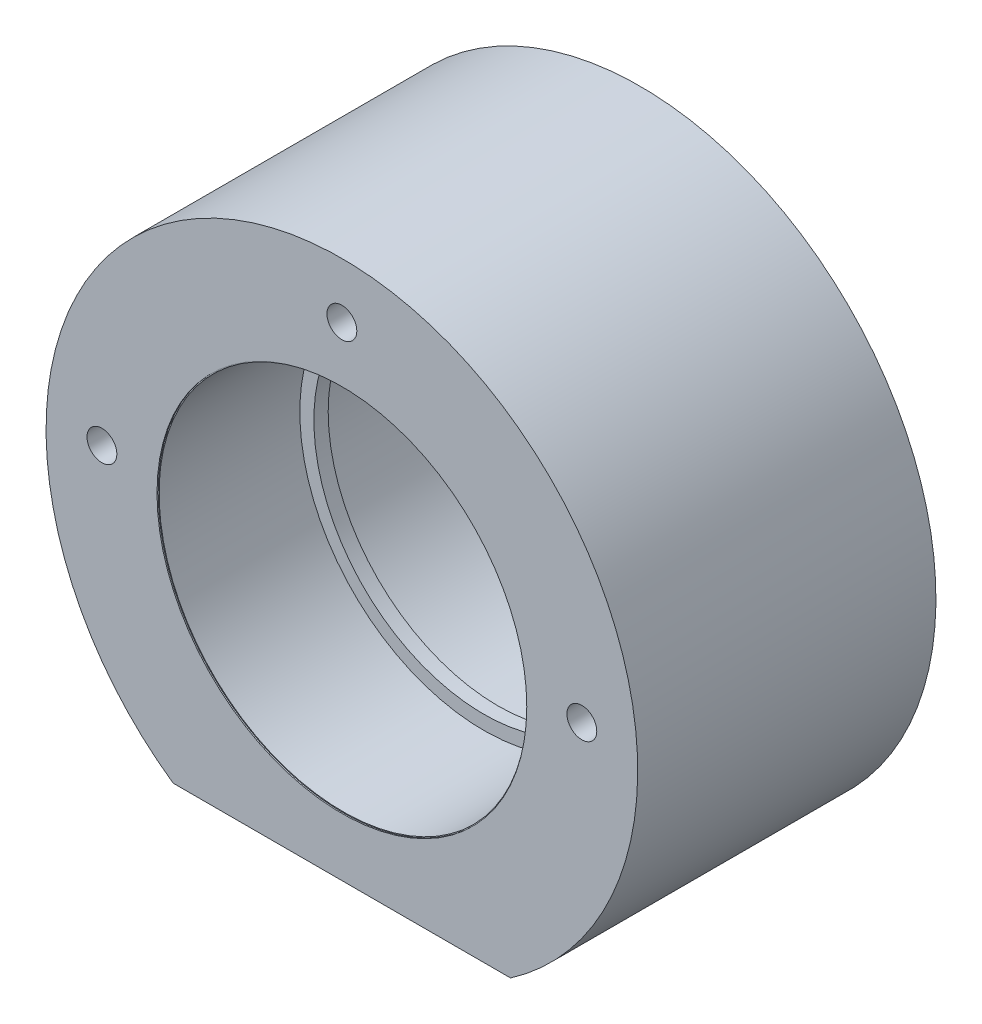
ISO-10303-21;
HEADER;
FILE_DESCRIPTION(('STEP AP214'),'2;1');
FILE_NAME('part.step','',(''),(''),'','','');
FILE_SCHEMA(('AUTOMOTIVE_DESIGN { 1 0 10303 214 1 1 1 1 }'));
ENDSEC;
DATA;
#1=APPLICATION_CONTEXT('core data for automotive mechanical design processes');
#2=APPLICATION_PROTOCOL_DEFINITION('international standard','automotive_design',2000,#1);
#3=PRODUCT_CONTEXT('',#1,'mechanical');
#4=PRODUCT('Part','Part','',(#3));
#5=PRODUCT_RELATED_PRODUCT_CATEGORY('part','',(#4));
#6=PRODUCT_DEFINITION_FORMATION('','',#4);
#7=PRODUCT_DEFINITION_CONTEXT('part definition',#1,'design');
#8=PRODUCT_DEFINITION('design','',#6,#7);
#9=PRODUCT_DEFINITION_SHAPE('','',#8);
#10=(LENGTH_UNIT() NAMED_UNIT(*) SI_UNIT(.MILLI.,.METRE.));
#11=(NAMED_UNIT(*) PLANE_ANGLE_UNIT() SI_UNIT($,.RADIAN.));
#12=(NAMED_UNIT(*) SI_UNIT($,.STERADIAN.) SOLID_ANGLE_UNIT());
#13=UNCERTAINTY_MEASURE_WITH_UNIT(LENGTH_MEASURE(1.E-05),#10,'distance_accuracy_value','');
#14=(GEOMETRIC_REPRESENTATION_CONTEXT(3) GLOBAL_UNCERTAINTY_ASSIGNED_CONTEXT((#13)) GLOBAL_UNIT_ASSIGNED_CONTEXT((#10,
#11,#12)) REPRESENTATION_CONTEXT('',''));
#15=CARTESIAN_POINT('',(0.,0.,0.));
#16=DIRECTION('',(0.,0.,1.));
#17=DIRECTION('',(1.,0.,0.));
#18=AXIS2_PLACEMENT_3D('',#15,#16,#17);
#19=CARTESIAN_POINT('',(0.,21.6034958595708,-82.4708842201519));
#20=DIRECTION('',(0.,0.,1.));
#21=DIRECTION('',(1.,0.,0.));
#22=AXIS2_PLACEMENT_3D('',#19,#20,#21);
#23=CYLINDRICAL_SURFACE('',#22,28.4985714215);
#24=CARTESIAN_POINT('',(0.,21.6034958595708,26.200714275));
#25=DIRECTION('',(0.,0.,1.));
#26=DIRECTION('',(1.,0.,0.));
#27=AXIS2_PLACEMENT_3D('',#24,#25,#26);
#28=CIRCLE('',#27,28.4985714215);
#29=CARTESIAN_POINT('',(28.4985714215,21.6034958595708,26.200714275));
#30=VERTEX_POINT('',#29);
#31=EDGE_CURVE('E100',#30,#30,#28,.F.);
#32=ORIENTED_EDGE('',*,*,#31,.F.);
#33=EDGE_LOOP('',(#32));
#34=FACE_BOUND('',#33,.T.);
#35=CARTESIAN_POINT('',(0.,21.6034958595708,23.799285725));
#36=DIRECTION('',(0.,0.,-1.));
#37=DIRECTION('',(-1.,0.,0.));
#38=AXIS2_PLACEMENT_3D('',#35,#36,#37);
#39=CIRCLE('',#38,28.4985714215);
#40=CARTESIAN_POINT('',(-28.4985714215,21.6034958595708,23.799285725));
#41=VERTEX_POINT('',#40);
#42=EDGE_CURVE('E51',#41,#41,#39,.F.);
#43=ORIENTED_EDGE('',*,*,#42,.F.);
#44=EDGE_LOOP('',(#43));
#45=FACE_BOUND('',#44,.T.);
#46=ADVANCED_FACE('F47',(#34,#45),#23,.F.);
#47=CARTESIAN_POINT('',(0.,21.6034958595708,69.285714275));
#48=DIRECTION('',(0.,0.,-1.));
#49=DIRECTION('',(-1.,0.,0.));
#50=AXIS2_PLACEMENT_3D('',#47,#48,#49);
#51=CYLINDRICAL_SURFACE('',#50,49.599999988);
#52=CARTESIAN_POINT('',(0.,21.6034958595708,50.000714275));
#53=DIRECTION('',(0.,0.,1.));
#54=DIRECTION('',(1.,0.,0.));
#55=AXIS2_PLACEMENT_3D('',#52,#53,#54);
#56=CIRCLE('',#55,49.599999988);
#57=CARTESIAN_POINT('',(28.2874458276026,-19.1393612734292,50.000714275));
#58=VERTEX_POINT('',#57);
#59=CARTESIAN_POINT('',(-28.2874458276026,-19.1393612734292,50.000714275));
#60=VERTEX_POINT('',#59);
#61=EDGE_CURVE('E63',#58,#60,#56,.T.);
#62=ORIENTED_EDGE('',*,*,#61,.F.);
#63=DIRECTION('',(0.,0.,-1.));
#64=VECTOR('',#63,1.);
#65=CARTESIAN_POINT('',(28.2874458276026,-19.1393612734292,69.285714275));
#66=LINE('',#65,#64);
#67=CARTESIAN_POINT('',(28.2874458276026,-19.1393612734292,-0.00071427499999388));
#68=VERTEX_POINT('',#67);
#69=EDGE_CURVE('E56',#58,#68,#66,.T.);
#70=ORIENTED_EDGE('',*,*,#69,.T.);
#71=CARTESIAN_POINT('',(0.,21.6034958595708,-0.000714275000000819));
#72=DIRECTION('',(0.,0.,1.));
#73=DIRECTION('',(1.,0.,0.));
#74=AXIS2_PLACEMENT_3D('',#71,#72,#73);
#75=CIRCLE('',#74,49.599999988);
#76=CARTESIAN_POINT('',(-28.2874458276026,-19.1393612734292,-0.000714275000000819));
#77=VERTEX_POINT('',#76);
#78=EDGE_CURVE('E99',#68,#77,#75,.T.);
#79=ORIENTED_EDGE('',*,*,#78,.T.);
#80=DIRECTION('',(0.,0.,-1.));
#81=VECTOR('',#80,1.);
#82=CARTESIAN_POINT('',(-28.2874458276026,-19.1393612734292,69.285714275));
#83=LINE('',#82,#81);
#84=EDGE_CURVE('E12',#60,#77,#83,.T.);
#85=ORIENTED_EDGE('',*,*,#84,.F.);
#86=EDGE_LOOP('',(#62,#70,#79,#85));
#87=FACE_BOUND('',#86,.T.);
#88=ADVANCED_FACE('F49',(#87),#51,.T.);
#89=CARTESIAN_POINT('',(-28.2874458276026,-19.1393612734292,69.285714275));
#90=DIRECTION('',(0.,1.,0.));
#91=DIRECTION('',(0.,0.,1.));
#92=AXIS2_PLACEMENT_3D('',#89,#90,#91);
#93=PLANE('',#92);
#94=DIRECTION('',(-1.,0.,0.));
#95=VECTOR('',#94,1.);
#96=CARTESIAN_POINT('',(0.,-19.1393612734292,50.000714275));
#97=LINE('',#96,#95);
#98=EDGE_CURVE('E74',#58,#60,#97,.T.);
#99=ORIENTED_EDGE('',*,*,#98,.T.);
#100=ORIENTED_EDGE('',*,*,#84,.T.);
#101=DIRECTION('',(1.,0.,0.));
#102=VECTOR('',#101,1.);
#103=CARTESIAN_POINT('',(0.,-19.1393612734292,-0.000714275000000819));
#104=LINE('',#103,#102);
#105=EDGE_CURVE('E86',#77,#68,#104,.T.);
#106=ORIENTED_EDGE('',*,*,#105,.T.);
#107=ORIENTED_EDGE('',*,*,#69,.F.);
#108=EDGE_LOOP('',(#99,#100,#106,#107));
#109=FACE_BOUND('',#108,.T.);
#110=ADVANCED_FACE('F84',(#109),#93,.F.);
#111=CARTESIAN_POINT('',(0.,21.6034958595708,49.799999994));
#112=DIRECTION('',(0.,0.,1.));
#113=DIRECTION('',(1.,0.,0.));
#114=AXIS2_PLACEMENT_3D('',#111,#112,#113);
#115=CYLINDRICAL_SURFACE('',#114,30.9999999925);
#116=CARTESIAN_POINT('',(0.,21.6034958595708,49.799999994));
#117=DIRECTION('',(0.,0.,1.));
#118=DIRECTION('',(1.,0.,0.));
#119=AXIS2_PLACEMENT_3D('',#116,#117,#118);
#120=CIRCLE('',#119,30.9999999925);
#121=CARTESIAN_POINT('',(30.9999999925,21.6034958595708,49.799999994));
#122=VERTEX_POINT('',#121);
#123=EDGE_CURVE('E87',#122,#122,#120,.T.);
#124=ORIENTED_EDGE('',*,*,#123,.F.);
#125=EDGE_LOOP('',(#124));
#126=FACE_BOUND('',#125,.T.);
#127=CARTESIAN_POINT('',(0.,21.6034958595708,50.000714275));
#128=DIRECTION('',(0.,0.,1.));
#129=DIRECTION('',(1.,0.,0.));
#130=AXIS2_PLACEMENT_3D('',#127,#128,#129);
#131=CIRCLE('',#130,30.9999999925);
#132=CARTESIAN_POINT('',(30.9999999925,21.6034958595708,50.000714275));
#133=VERTEX_POINT('',#132);
#134=EDGE_CURVE('E79',#133,#133,#131,.F.);
#135=ORIENTED_EDGE('',*,*,#134,.F.);
#136=EDGE_LOOP('',(#135));
#137=FACE_BOUND('',#136,.T.);
#138=ADVANCED_FACE('F258',(#126,#137),#115,.F.);
#139=CARTESIAN_POINT('',(0.,21.6034958595708,49.799999994));
#140=DIRECTION('',(0.,0.,1.));
#141=DIRECTION('',(1.,0.,0.));
#142=AXIS2_PLACEMENT_3D('',#139,#140,#141);
#143=PLANE('',#142);
#144=CARTESIAN_POINT('',(0.,21.6034958595708,49.799999994));
#145=DIRECTION('',(0.,0.,1.));
#146=DIRECTION('',(1.,0.,0.));
#147=AXIS2_PLACEMENT_3D('',#144,#145,#146);
#148=CIRCLE('',#147,30.85);
#149=CARTESIAN_POINT('',(30.85,21.6034958595708,49.799999994));
#150=VERTEX_POINT('',#149);
#151=EDGE_CURVE('E81',#150,#150,#148,.T.);
#152=ORIENTED_EDGE('',*,*,#151,.F.);
#153=EDGE_LOOP('',(#152));
#154=FACE_BOUND('',#153,.T.);
#155=ORIENTED_EDGE('',*,*,#123,.T.);
#156=EDGE_LOOP('',(#155));
#157=FACE_BOUND('',#156,.T.);
#158=ADVANCED_FACE('F142',(#154,#157),#143,.T.);
#159=CARTESIAN_POINT('',(0.,21.6034958595708,0.200000005999997));
#160=DIRECTION('',(0.,0.,-1.));
#161=DIRECTION('',(-1.,0.,0.));
#162=AXIS2_PLACEMENT_3D('',#159,#160,#161);
#163=CYLINDRICAL_SURFACE('',#162,30.9999999925);
#164=CARTESIAN_POINT('',(0.,21.6034958595708,-0.000714275000000819));
#165=DIRECTION('',(0.,0.,1.));
#166=DIRECTION('',(1.,0.,0.));
#167=AXIS2_PLACEMENT_3D('',#164,#165,#166);
#168=CIRCLE('',#167,30.9999999925);
#169=CARTESIAN_POINT('',(30.9999999925,21.6034958595708,-0.000714275000000819));
#170=VERTEX_POINT('',#169);
#171=EDGE_CURVE('E94',#170,#170,#168,.T.);
#172=ORIENTED_EDGE('',*,*,#171,.F.);
#173=EDGE_LOOP('',(#172));
#174=FACE_BOUND('',#173,.T.);
#175=CARTESIAN_POINT('',(0.,21.6034958595708,0.200000005999997));
#176=DIRECTION('',(0.,0.,1.));
#177=DIRECTION('',(1.,0.,0.));
#178=AXIS2_PLACEMENT_3D('',#175,#176,#177);
#179=CIRCLE('',#178,30.9999999925);
#180=CARTESIAN_POINT('',(30.9999999925,21.6034958595708,0.200000005999997));
#181=VERTEX_POINT('',#180);
#182=EDGE_CURVE('E90',#181,#181,#179,.T.);
#183=ORIENTED_EDGE('',*,*,#182,.T.);
#184=EDGE_LOOP('',(#183));
#185=FACE_BOUND('',#184,.T.);
#186=ADVANCED_FACE('F129',(#174,#185),#163,.F.);
#187=CARTESIAN_POINT('',(0.,21.6034958595708,0.200000005999997));
#188=DIRECTION('',(0.,0.,-1.));
#189=DIRECTION('',(1.,0.,0.));
#190=AXIS2_PLACEMENT_3D('',#187,#188,#189);
#191=PLANE('',#190);
#192=CARTESIAN_POINT('',(0.,21.6034958595708,0.200000005999998));
#193=DIRECTION('',(0.,0.,-1.));
#194=DIRECTION('',(-1.,0.,0.));
#195=AXIS2_PLACEMENT_3D('',#192,#193,#194);
#196=CIRCLE('',#195,30.85);
#197=CARTESIAN_POINT('',(-30.85,21.6034958595708,0.200000005999998));
#198=VERTEX_POINT('',#197);
#199=EDGE_CURVE('E105',#198,#198,#196,.F.);
#200=ORIENTED_EDGE('',*,*,#199,.T.);
#201=EDGE_LOOP('',(#200));
#202=FACE_BOUND('',#201,.T.);
#203=ORIENTED_EDGE('',*,*,#182,.F.);
#204=EDGE_LOOP('',(#203));
#205=FACE_BOUND('',#204,.T.);
#206=ADVANCED_FACE('F131',(#202,#205),#191,.T.);
#207=CARTESIAN_POINT('',(0.,21.6034958595708,-0.000714275000000819));
#208=DIRECTION('',(0.,0.,1.));
#209=DIRECTION('',(1.,0.,0.));
#210=AXIS2_PLACEMENT_3D('',#207,#208,#209);
#211=PLANE('',#210);
#212=CARTESIAN_POINT('',(-40.2334024909348,23.9193810040543,-0.000714275000000819));
#213=DIRECTION('',(0.,0.,1.));
#214=DIRECTION('',(1.,0.,0.));
#215=AXIS2_PLACEMENT_3D('',#212,#213,#214);
#216=CIRCLE('',#215,2.5);
#217=CARTESIAN_POINT('',(-37.7334024909348,23.9193810040543,-0.000714275000001686));
#218=VERTEX_POINT('',#217);
#219=EDGE_CURVE('E112',#218,#218,#216,.F.);
#220=ORIENTED_EDGE('',*,*,#219,.F.);
#221=EDGE_LOOP('',(#220));
#222=FACE_BOUND('',#221,.T.);
#223=CARTESIAN_POINT('',(40.2334007714421,23.9194108762585,-0.000714275000000819));
#224=DIRECTION('',(0.,0.,1.));
#225=DIRECTION('',(1.,0.,0.));
#226=AXIS2_PLACEMENT_3D('',#223,#224,#225);
#227=CIRCLE('',#226,2.5);
#228=CARTESIAN_POINT('',(42.7334007714421,23.9194108762585,-0.000714275000001686));
#229=VERTEX_POINT('',#228);
#230=EDGE_CURVE('E193',#229,#229,#227,.F.);
#231=ORIENTED_EDGE('',*,*,#230,.F.);
#232=EDGE_LOOP('',(#231));
#233=FACE_BOUND('',#232,.T.);
#234=CARTESIAN_POINT('',(0.,61.9034958595708,-0.000714275000000819));
#235=DIRECTION('',(0.,0.,1.));
#236=DIRECTION('',(1.,0.,0.));
#237=AXIS2_PLACEMENT_3D('',#234,#235,#236);
#238=CIRCLE('',#237,2.5);
#239=CARTESIAN_POINT('',(2.5,61.9034958595708,-0.000714275000001686));
#240=VERTEX_POINT('',#239);
#241=EDGE_CURVE('E197',#240,#240,#238,.F.);
#242=ORIENTED_EDGE('',*,*,#241,.F.);
#243=EDGE_LOOP('',(#242));
#244=FACE_BOUND('',#243,.T.);
#245=ORIENTED_EDGE('',*,*,#171,.T.);
#246=EDGE_LOOP('',(#245));
#247=FACE_BOUND('',#246,.T.);
#248=ORIENTED_EDGE('',*,*,#78,.F.);
#249=ORIENTED_EDGE('',*,*,#105,.F.);
#250=EDGE_LOOP('',(#248,#249));
#251=FACE_BOUND('',#250,.T.);
#252=ADVANCED_FACE('F133',(#222,#233,#244,#247,#251),#211,.F.);
#253=CARTESIAN_POINT('',(0.,21.6034958595708,50.000714275));
#254=DIRECTION('',(0.,0.,1.));
#255=DIRECTION('',(1.,0.,0.));
#256=AXIS2_PLACEMENT_3D('',#253,#254,#255);
#257=PLANE('',#256);
#258=CARTESIAN_POINT('',(-40.2334024909348,23.9193810040543,50.000714275));
#259=DIRECTION('',(0.,0.,1.));
#260=DIRECTION('',(1.,0.,0.));
#261=AXIS2_PLACEMENT_3D('',#258,#259,#260);
#262=CIRCLE('',#261,2.5);
#263=CARTESIAN_POINT('',(-37.7334024909348,23.9193810040543,50.000714275));
#264=VERTEX_POINT('',#263);
#265=EDGE_CURVE('E117',#264,#264,#262,.T.);
#266=ORIENTED_EDGE('',*,*,#265,.F.);
#267=EDGE_LOOP('',(#266));
#268=FACE_BOUND('',#267,.T.);
#269=CARTESIAN_POINT('',(40.2334007714421,23.9194108762585,50.000714275));
#270=DIRECTION('',(0.,0.,1.));
#271=DIRECTION('',(1.,0.,0.));
#272=AXIS2_PLACEMENT_3D('',#269,#270,#271);
#273=CIRCLE('',#272,2.5);
#274=CARTESIAN_POINT('',(42.7334007714421,23.9194108762585,50.000714275));
#275=VERTEX_POINT('',#274);
#276=EDGE_CURVE('E190',#275,#275,#273,.T.);
#277=ORIENTED_EDGE('',*,*,#276,.F.);
#278=EDGE_LOOP('',(#277));
#279=FACE_BOUND('',#278,.T.);
#280=CARTESIAN_POINT('',(0.,61.9034958595708,50.000714275));
#281=DIRECTION('',(0.,0.,1.));
#282=DIRECTION('',(1.,0.,0.));
#283=AXIS2_PLACEMENT_3D('',#280,#281,#282);
#284=CIRCLE('',#283,2.5);
#285=CARTESIAN_POINT('',(2.5,61.9034958595708,50.000714275));
#286=VERTEX_POINT('',#285);
#287=EDGE_CURVE('E121',#286,#286,#284,.T.);
#288=ORIENTED_EDGE('',*,*,#287,.F.);
#289=EDGE_LOOP('',(#288));
#290=FACE_BOUND('',#289,.T.);
#291=ORIENTED_EDGE('',*,*,#61,.T.);
#292=ORIENTED_EDGE('',*,*,#98,.F.);
#293=EDGE_LOOP('',(#291,#292));
#294=FACE_BOUND('',#293,.T.);
#295=ORIENTED_EDGE('',*,*,#134,.T.);
#296=EDGE_LOOP('',(#295));
#297=FACE_BOUND('',#296,.T.);
#298=ADVANCED_FACE('F75',(#268,#279,#290,#294,#297),#257,.T.);
#299=CARTESIAN_POINT('',(0.,21.6034958595708,26.200714275));
#300=DIRECTION('',(0.,0.,1.));
#301=DIRECTION('',(1.,0.,0.));
#302=AXIS2_PLACEMENT_3D('',#299,#300,#301);
#303=PLANE('',#302);
#304=CARTESIAN_POINT('',(0.,21.6034958595708,26.200714275));
#305=DIRECTION('',(0.,0.,1.));
#306=DIRECTION('',(1.,0.,0.));
#307=AXIS2_PLACEMENT_3D('',#304,#305,#306);
#308=CIRCLE('',#307,30.85);
#309=CARTESIAN_POINT('',(30.85,21.6034958595708,26.200714275));
#310=VERTEX_POINT('',#309);
#311=EDGE_CURVE('E103',#310,#310,#308,.T.);
#312=ORIENTED_EDGE('',*,*,#311,.T.);
#313=EDGE_LOOP('',(#312));
#314=FACE_BOUND('',#313,.T.);
#315=ORIENTED_EDGE('',*,*,#31,.T.);
#316=EDGE_LOOP('',(#315));
#317=FACE_BOUND('',#316,.T.);
#318=ADVANCED_FACE('F156',(#314,#317),#303,.T.);
#319=CARTESIAN_POINT('',(0.,21.6034958595708,26.200714275));
#320=DIRECTION('',(0.,0.,1.));
#321=DIRECTION('',(1.,0.,0.));
#322=AXIS2_PLACEMENT_3D('',#319,#320,#321);
#323=CYLINDRICAL_SURFACE('',#322,30.85);
#324=ORIENTED_EDGE('',*,*,#151,.T.);
#325=EDGE_LOOP('',(#324));
#326=FACE_BOUND('',#325,.T.);
#327=ORIENTED_EDGE('',*,*,#311,.F.);
#328=EDGE_LOOP('',(#327));
#329=FACE_BOUND('',#328,.T.);
#330=ADVANCED_FACE('F158',(#326,#329),#323,.F.);
#331=CARTESIAN_POINT('',(0.,21.6034958595708,23.799285725));
#332=DIRECTION('',(0.,0.,-1.));
#333=DIRECTION('',(1.,0.,0.));
#334=AXIS2_PLACEMENT_3D('',#331,#332,#333);
#335=PLANE('',#334);
#336=CARTESIAN_POINT('',(0.,21.6034958595708,23.799285725));
#337=DIRECTION('',(0.,0.,1.));
#338=DIRECTION('',(1.,0.,0.));
#339=AXIS2_PLACEMENT_3D('',#336,#337,#338);
#340=CIRCLE('',#339,30.85);
#341=CARTESIAN_POINT('',(30.85,21.6034958595708,23.799285725));
#342=VERTEX_POINT('',#341);
#343=EDGE_CURVE('E107',#342,#342,#340,.T.);
#344=ORIENTED_EDGE('',*,*,#343,.F.);
#345=EDGE_LOOP('',(#344));
#346=FACE_BOUND('',#345,.T.);
#347=ORIENTED_EDGE('',*,*,#42,.T.);
#348=EDGE_LOOP('',(#347));
#349=FACE_BOUND('',#348,.T.);
#350=ADVANCED_FACE('F161',(#346,#349),#335,.T.);
#351=CARTESIAN_POINT('',(0.,21.6034958595708,23.799285725));
#352=DIRECTION('',(0.,0.,-1.));
#353=DIRECTION('',(-1.,0.,0.));
#354=AXIS2_PLACEMENT_3D('',#351,#352,#353);
#355=CYLINDRICAL_SURFACE('',#354,30.85);
#356=ORIENTED_EDGE('',*,*,#199,.F.);
#357=EDGE_LOOP('',(#356));
#358=FACE_BOUND('',#357,.T.);
#359=ORIENTED_EDGE('',*,*,#343,.T.);
#360=EDGE_LOOP('',(#359));
#361=FACE_BOUND('',#360,.T.);
#362=ADVANCED_FACE('F166',(#358,#361),#355,.F.);
#363=CARTESIAN_POINT('',(0.,61.9034958595708,-7.07178208686548));
#364=DIRECTION('',(0.,0.,1.));
#365=DIRECTION('',(1.,0.,0.));
#366=AXIS2_PLACEMENT_3D('',#363,#364,#365);
#367=CYLINDRICAL_SURFACE('',#366,2.5);
#368=CARTESIAN_POINT('',(2.5,61.9034958595708,50.000714275));
#369=CARTESIAN_POINT('',(2.5,61.9034958595708,49.4798660609375));
#370=CARTESIAN_POINT('',(2.5,61.9034958595708,48.959017846875));
#371=CARTESIAN_POINT('',(2.5,61.9034958595708,47.91732141875));
#372=CARTESIAN_POINT('',(2.5,61.9034958595708,47.3964732046875));
#373=CARTESIAN_POINT('',(2.5,61.9034958595708,46.3547767765625));
#374=CARTESIAN_POINT('',(2.5,61.9034958595708,45.8339285625));
#375=CARTESIAN_POINT('',(2.5,61.9034958595708,44.792232134375));
#376=CARTESIAN_POINT('',(2.5,61.9034958595708,44.2713839203125));
#377=CARTESIAN_POINT('',(2.5,61.9034958595708,43.2296874921875));
#378=CARTESIAN_POINT('',(2.5,61.9034958595708,42.708839278125));
#379=CARTESIAN_POINT('',(2.5,61.9034958595708,41.66714285));
#380=CARTESIAN_POINT('',(2.5,61.9034958595708,41.1462946359375));
#381=CARTESIAN_POINT('',(2.5,61.9034958595708,40.1045982078125));
#382=CARTESIAN_POINT('',(2.5,61.9034958595708,39.58374999375));
#383=CARTESIAN_POINT('',(2.5,61.9034958595708,38.542053565625));
#384=CARTESIAN_POINT('',(2.5,61.9034958595708,38.0212053515625));
#385=CARTESIAN_POINT('',(2.5,61.9034958595708,36.9795089234375));
#386=CARTESIAN_POINT('',(2.5,61.9034958595708,36.458660709375));
#387=CARTESIAN_POINT('',(2.5,61.9034958595708,35.41696428125));
#388=CARTESIAN_POINT('',(2.5,61.9034958595708,34.8961160671875));
#389=CARTESIAN_POINT('',(2.5,61.9034958595708,33.8544196390625));
#390=CARTESIAN_POINT('',(2.5,61.9034958595708,33.333571425));
#391=CARTESIAN_POINT('',(2.5,61.9034958595708,32.291874996875));
#392=CARTESIAN_POINT('',(2.5,61.9034958595708,31.7710267828125));
#393=CARTESIAN_POINT('',(2.5,61.9034958595708,30.7293303546875));
#394=CARTESIAN_POINT('',(2.5,61.9034958595708,30.208482140625));
#395=CARTESIAN_POINT('',(2.5,61.9034958595708,29.1667857125));
#396=CARTESIAN_POINT('',(2.5,61.9034958595708,28.6459374984375));
#397=CARTESIAN_POINT('',(2.5,61.9034958595708,27.6042410703125));
#398=CARTESIAN_POINT('',(2.5,61.9034958595708,27.08339285625));
#399=CARTESIAN_POINT('',(2.5,61.9034958595708,26.041696428125));
#400=CARTESIAN_POINT('',(2.5,61.9034958595708,25.5208482140625));
#401=CARTESIAN_POINT('',(2.5,61.9034958595708,24.4791517859375));
#402=CARTESIAN_POINT('',(2.5,61.9034958595708,23.958303571875));
#403=CARTESIAN_POINT('',(2.5,61.9034958595708,22.91660714375));
#404=CARTESIAN_POINT('',(2.5,61.9034958595708,22.3957589296875));
#405=CARTESIAN_POINT('',(2.5,61.9034958595708,21.3540625015625));
#406=CARTESIAN_POINT('',(2.5,61.9034958595708,20.8332142875));
#407=CARTESIAN_POINT('',(2.5,61.9034958595708,19.791517859375));
#408=CARTESIAN_POINT('',(2.5,61.9034958595708,19.2706696453125));
#409=CARTESIAN_POINT('',(2.5,61.9034958595708,18.2289732171875));
#410=CARTESIAN_POINT('',(2.5,61.9034958595708,17.708125003125));
#411=CARTESIAN_POINT('',(2.5,61.9034958595708,16.666428575));
#412=CARTESIAN_POINT('',(2.5,61.9034958595708,16.1455803609375));
#413=CARTESIAN_POINT('',(2.5,61.9034958595708,15.1038839328125));
#414=CARTESIAN_POINT('',(2.5,61.9034958595708,14.58303571875));
#415=CARTESIAN_POINT('',(2.5,61.9034958595708,13.541339290625));
#416=CARTESIAN_POINT('',(2.5,61.9034958595708,13.0204910765625));
#417=CARTESIAN_POINT('',(2.5,61.9034958595708,11.9787946484375));
#418=CARTESIAN_POINT('',(2.5,61.9034958595708,11.457946434375));
#419=CARTESIAN_POINT('',(2.5,61.9034958595708,10.41625000625));
#420=CARTESIAN_POINT('',(2.5,61.9034958595708,9.8954017921875));
#421=CARTESIAN_POINT('',(2.5,61.9034958595708,8.8537053640625));
#422=CARTESIAN_POINT('',(2.5,61.9034958595708,8.33285715));
#423=CARTESIAN_POINT('',(2.5,61.9034958595708,7.291160721875));
#424=CARTESIAN_POINT('',(2.5,61.9034958595708,6.7703125078125));
#425=CARTESIAN_POINT('',(2.5,61.9034958595708,5.7286160796875));
#426=CARTESIAN_POINT('',(2.5,61.9034958595708,5.207767865625));
#427=CARTESIAN_POINT('',(2.5,61.9034958595708,4.1660714375));
#428=CARTESIAN_POINT('',(2.5,61.9034958595708,3.6452232234375));
#429=CARTESIAN_POINT('',(2.5,61.9034958595708,2.6035267953125));
#430=CARTESIAN_POINT('',(2.5,61.9034958595708,2.08267858125));
#431=CARTESIAN_POINT('',(2.5,61.9034958595708,1.040982153125));
#432=CARTESIAN_POINT('',(2.5,61.9034958595708,0.5201339390625));
#433=CARTESIAN_POINT('',(2.5,61.9034958595708,-0.000714275000001686));
#434=B_SPLINE_CURVE_WITH_KNOTS('',3,(#368,#369,#370,#371,#372,#373,#374,#375,#376,#377,#378,
#379,#380,#381,#382,#383,#384,#385,#386,#387,#388,#389,#390,#391,#392,#393,#394,#395,#396,#397,
#398,#399,#400,#401,#402,#403,#404,#405,#406,#407,#408,#409,#410,#411,#412,#413,#414,#415,#416,
#417,#418,#419,#420,#421,#422,#423,#424,#425,#426,#427,#428,#429,#430,#431,#432,#433),
.UNSPECIFIED.,.F.,.F.,(4,2,2,2,2,2,2,2,2,2,2,2,2,2,2,2,2,2,2,2,2,2,2,2,2,2,2,2,2,2,2,2,4),(0.,
1.5625446421875,3.125089284375,4.6876339265625,6.25017856875,7.8127232109375,9.37526785312501,
10.9378124953125,12.5003571375,14.0629017796875,15.625446421875,17.1879910640625,18.75053570625,
20.3130803484375,21.875624990625,23.4381696328125,25.000714275,26.5632589171875,28.125803559375,
29.6883482015625,31.25089284375,32.8134374859375,34.375982128125,35.9385267703125,37.5010714125,
39.0636160546875,40.626160696875,42.1887053390625,43.75124998125,45.3137946234375,
46.876339265625,48.4388839078125,50.00142855),.UNSPECIFIED.);
#435=EDGE_CURVE('BSEAM169',#286,#240,#434,.T.);
#436=ORIENTED_EDGE('',*,*,#287,.T.);
#437=ORIENTED_EDGE('',*,*,#241,.T.);
#438=ORIENTED_EDGE('',*,*,#435,.T.);
#439=ORIENTED_EDGE('',*,*,#435,.F.);
#440=EDGE_LOOP('',(#436,#438,#437,#439));
#441=FACE_BOUND('',#440,.T.);
#442=ADVANCED_FACE('F169',(#441),#367,.F.);
#443=CARTESIAN_POINT('',(40.2334007714421,23.9194108762585,-7.07178208686548));
#444=DIRECTION('',(0.,0.,1.));
#445=DIRECTION('',(1.,0.,0.));
#446=AXIS2_PLACEMENT_3D('',#443,#444,#445);
#447=CYLINDRICAL_SURFACE('',#446,2.5);
#448=CARTESIAN_POINT('',(42.7334007714421,23.9194108762585,-0.000714275000001686));
#449=CARTESIAN_POINT('',(42.7334007714421,23.9194108762585,0.520133939062498));
#450=CARTESIAN_POINT('',(42.7334007714421,23.9194108762585,1.040982153125));
#451=CARTESIAN_POINT('',(42.7334007714421,23.9194108762585,2.08267858125));
#452=CARTESIAN_POINT('',(42.7334007714421,23.9194108762585,2.6035267953125));
#453=CARTESIAN_POINT('',(42.7334007714421,23.9194108762585,3.6452232234375));
#454=CARTESIAN_POINT('',(42.7334007714421,23.9194108762585,4.1660714375));
#455=CARTESIAN_POINT('',(42.7334007714421,23.9194108762585,5.207767865625));
#456=CARTESIAN_POINT('',(42.7334007714421,23.9194108762585,5.7286160796875));
#457=CARTESIAN_POINT('',(42.7334007714421,23.9194108762585,6.7703125078125));
#458=CARTESIAN_POINT('',(42.7334007714421,23.9194108762585,7.291160721875));
#459=CARTESIAN_POINT('',(42.7334007714421,23.9194108762585,8.33285715));
#460=CARTESIAN_POINT('',(42.7334007714421,23.9194108762585,8.8537053640625));
#461=CARTESIAN_POINT('',(42.7334007714421,23.9194108762585,9.8954017921875));
#462=CARTESIAN_POINT('',(42.7334007714421,23.9194108762585,10.41625000625));
#463=CARTESIAN_POINT('',(42.7334007714421,23.9194108762585,11.457946434375));
#464=CARTESIAN_POINT('',(42.7334007714421,23.9194108762585,11.9787946484375));
#465=CARTESIAN_POINT('',(42.7334007714421,23.9194108762585,13.0204910765625));
#466=CARTESIAN_POINT('',(42.7334007714421,23.9194108762585,13.541339290625));
#467=CARTESIAN_POINT('',(42.7334007714421,23.9194108762585,14.58303571875));
#468=CARTESIAN_POINT('',(42.7334007714421,23.9194108762585,15.1038839328125));
#469=CARTESIAN_POINT('',(42.7334007714421,23.9194108762585,16.1455803609375));
#470=CARTESIAN_POINT('',(42.7334007714421,23.9194108762585,16.666428575));
#471=CARTESIAN_POINT('',(42.7334007714421,23.9194108762585,17.708125003125));
#472=CARTESIAN_POINT('',(42.7334007714421,23.9194108762585,18.2289732171875));
#473=CARTESIAN_POINT('',(42.7334007714421,23.9194108762585,19.2706696453125));
#474=CARTESIAN_POINT('',(42.7334007714421,23.9194108762585,19.791517859375));
#475=CARTESIAN_POINT('',(42.7334007714421,23.9194108762585,20.8332142875));
#476=CARTESIAN_POINT('',(42.7334007714421,23.9194108762585,21.3540625015625));
#477=CARTESIAN_POINT('',(42.7334007714421,23.9194108762585,22.3957589296875));
#478=CARTESIAN_POINT('',(42.7334007714421,23.9194108762585,22.91660714375));
#479=CARTESIAN_POINT('',(42.7334007714421,23.9194108762585,23.958303571875));
#480=CARTESIAN_POINT('',(42.7334007714421,23.9194108762585,24.4791517859375));
#481=CARTESIAN_POINT('',(42.7334007714421,23.9194108762585,25.5208482140625));
#482=CARTESIAN_POINT('',(42.7334007714421,23.9194108762585,26.041696428125));
#483=CARTESIAN_POINT('',(42.7334007714421,23.9194108762585,27.08339285625));
#484=CARTESIAN_POINT('',(42.7334007714421,23.9194108762585,27.6042410703125));
#485=CARTESIAN_POINT('',(42.7334007714421,23.9194108762585,28.6459374984375));
#486=CARTESIAN_POINT('',(42.7334007714421,23.9194108762585,29.1667857125));
#487=CARTESIAN_POINT('',(42.7334007714421,23.9194108762585,30.208482140625));
#488=CARTESIAN_POINT('',(42.7334007714421,23.9194108762585,30.7293303546875));
#489=CARTESIAN_POINT('',(42.7334007714421,23.9194108762585,31.7710267828125));
#490=CARTESIAN_POINT('',(42.7334007714421,23.9194108762585,32.291874996875));
#491=CARTESIAN_POINT('',(42.7334007714421,23.9194108762585,33.333571425));
#492=CARTESIAN_POINT('',(42.7334007714421,23.9194108762585,33.8544196390625));
#493=CARTESIAN_POINT('',(42.7334007714421,23.9194108762585,34.8961160671875));
#494=CARTESIAN_POINT('',(42.7334007714421,23.9194108762585,35.41696428125));
#495=CARTESIAN_POINT('',(42.7334007714421,23.9194108762585,36.458660709375));
#496=CARTESIAN_POINT('',(42.7334007714421,23.9194108762585,36.9795089234375));
#497=CARTESIAN_POINT('',(42.7334007714421,23.9194108762585,38.0212053515625));
#498=CARTESIAN_POINT('',(42.7334007714421,23.9194108762585,38.542053565625));
#499=CARTESIAN_POINT('',(42.7334007714421,23.9194108762585,39.58374999375));
#500=CARTESIAN_POINT('',(42.7334007714421,23.9194108762585,40.1045982078125));
#501=CARTESIAN_POINT('',(42.7334007714421,23.9194108762585,41.1462946359375));
#502=CARTESIAN_POINT('',(42.7334007714421,23.9194108762585,41.66714285));
#503=CARTESIAN_POINT('',(42.7334007714421,23.9194108762585,42.708839278125));
#504=CARTESIAN_POINT('',(42.7334007714421,23.9194108762585,43.2296874921875));
#505=CARTESIAN_POINT('',(42.7334007714421,23.9194108762585,44.2713839203125));
#506=CARTESIAN_POINT('',(42.7334007714421,23.9194108762585,44.792232134375));
#507=CARTESIAN_POINT('',(42.7334007714421,23.9194108762585,45.8339285625));
#508=CARTESIAN_POINT('',(42.7334007714421,23.9194108762585,46.3547767765625));
#509=CARTESIAN_POINT('',(42.7334007714421,23.9194108762585,47.3964732046875));
#510=CARTESIAN_POINT('',(42.7334007714421,23.9194108762585,47.91732141875));
#511=CARTESIAN_POINT('',(42.7334007714421,23.9194108762585,48.959017846875));
#512=CARTESIAN_POINT('',(42.7334007714421,23.9194108762585,49.4798660609375));
#513=CARTESIAN_POINT('',(42.7334007714421,23.9194108762585,50.000714275));
#514=B_SPLINE_CURVE_WITH_KNOTS('',3,(#448,#449,#450,#451,#452,#453,#454,#455,#456,#457,#458,
#459,#460,#461,#462,#463,#464,#465,#466,#467,#468,#469,#470,#471,#472,#473,#474,#475,#476,#477,
#478,#479,#480,#481,#482,#483,#484,#485,#486,#487,#488,#489,#490,#491,#492,#493,#494,#495,#496,
#497,#498,#499,#500,#501,#502,#503,#504,#505,#506,#507,#508,#509,#510,#511,#512,#513),
.UNSPECIFIED.,.F.,.F.,(4,2,2,2,2,2,2,2,2,2,2,2,2,2,2,2,2,2,2,2,2,2,2,2,2,2,2,2,2,2,2,2,4),(0.,
1.5625446421875,3.125089284375,4.6876339265625,6.25017856875,7.8127232109375,9.375267853125,
10.9378124953125,12.5003571375,14.0629017796875,15.625446421875,17.1879910640625,18.75053570625,
20.3130803484375,21.875624990625,23.4381696328125,25.000714275,26.5632589171875,28.125803559375,
29.6883482015625,31.25089284375,32.8134374859375,34.375982128125,35.9385267703125,37.5010714125,
39.0636160546875,40.626160696875,42.1887053390625,43.75124998125,45.3137946234375,
46.876339265625,48.4388839078125,50.00142855),.UNSPECIFIED.);
#515=EDGE_CURVE('BSEAM176',#229,#275,#514,.T.);
#516=ORIENTED_EDGE('',*,*,#230,.T.);
#517=ORIENTED_EDGE('',*,*,#276,.T.);
#518=ORIENTED_EDGE('',*,*,#515,.T.);
#519=ORIENTED_EDGE('',*,*,#515,.F.);
#520=EDGE_LOOP('',(#516,#518,#517,#519));
#521=FACE_BOUND('',#520,.T.);
#522=ADVANCED_FACE('F176',(#521),#447,.F.);
#523=CARTESIAN_POINT('',(-40.2334024909348,23.9193810040543,-7.07178208686548));
#524=DIRECTION('',(0.,0.,1.));
#525=DIRECTION('',(1.,0.,0.));
#526=AXIS2_PLACEMENT_3D('',#523,#524,#525);
#527=CYLINDRICAL_SURFACE('',#526,2.5);
#528=CARTESIAN_POINT('',(-37.7334024909348,23.9193810040543,-0.000714275000001686));
#529=CARTESIAN_POINT('',(-37.7334024909348,23.9193810040543,0.520133939062498));
#530=CARTESIAN_POINT('',(-37.7334024909348,23.9193810040543,1.040982153125));
#531=CARTESIAN_POINT('',(-37.7334024909348,23.9193810040543,2.08267858125));
#532=CARTESIAN_POINT('',(-37.7334024909348,23.9193810040543,2.6035267953125));
#533=CARTESIAN_POINT('',(-37.7334024909348,23.9193810040543,3.6452232234375));
#534=CARTESIAN_POINT('',(-37.7334024909348,23.9193810040543,4.1660714375));
#535=CARTESIAN_POINT('',(-37.7334024909348,23.9193810040543,5.207767865625));
#536=CARTESIAN_POINT('',(-37.7334024909348,23.9193810040543,5.7286160796875));
#537=CARTESIAN_POINT('',(-37.7334024909348,23.9193810040543,6.7703125078125));
#538=CARTESIAN_POINT('',(-37.7334024909348,23.9193810040543,7.291160721875));
#539=CARTESIAN_POINT('',(-37.7334024909348,23.9193810040543,8.33285715));
#540=CARTESIAN_POINT('',(-37.7334024909348,23.9193810040543,8.8537053640625));
#541=CARTESIAN_POINT('',(-37.7334024909348,23.9193810040543,9.8954017921875));
#542=CARTESIAN_POINT('',(-37.7334024909348,23.9193810040543,10.41625000625));
#543=CARTESIAN_POINT('',(-37.7334024909348,23.9193810040543,11.457946434375));
#544=CARTESIAN_POINT('',(-37.7334024909348,23.9193810040543,11.9787946484375));
#545=CARTESIAN_POINT('',(-37.7334024909348,23.9193810040543,13.0204910765625));
#546=CARTESIAN_POINT('',(-37.7334024909348,23.9193810040543,13.541339290625));
#547=CARTESIAN_POINT('',(-37.7334024909348,23.9193810040543,14.58303571875));
#548=CARTESIAN_POINT('',(-37.7334024909348,23.9193810040543,15.1038839328125));
#549=CARTESIAN_POINT('',(-37.7334024909348,23.9193810040543,16.1455803609375));
#550=CARTESIAN_POINT('',(-37.7334024909348,23.9193810040543,16.666428575));
#551=CARTESIAN_POINT('',(-37.7334024909348,23.9193810040543,17.708125003125));
#552=CARTESIAN_POINT('',(-37.7334024909348,23.9193810040543,18.2289732171875));
#553=CARTESIAN_POINT('',(-37.7334024909348,23.9193810040543,19.2706696453125));
#554=CARTESIAN_POINT('',(-37.7334024909348,23.9193810040543,19.791517859375));
#555=CARTESIAN_POINT('',(-37.7334024909348,23.9193810040543,20.8332142875));
#556=CARTESIAN_POINT('',(-37.7334024909348,23.9193810040543,21.3540625015625));
#557=CARTESIAN_POINT('',(-37.7334024909348,23.9193810040543,22.3957589296875));
#558=CARTESIAN_POINT('',(-37.7334024909348,23.9193810040543,22.91660714375));
#559=CARTESIAN_POINT('',(-37.7334024909348,23.9193810040543,23.958303571875));
#560=CARTESIAN_POINT('',(-37.7334024909348,23.9193810040543,24.4791517859375));
#561=CARTESIAN_POINT('',(-37.7334024909348,23.9193810040543,25.5208482140625));
#562=CARTESIAN_POINT('',(-37.7334024909348,23.9193810040543,26.041696428125));
#563=CARTESIAN_POINT('',(-37.7334024909348,23.9193810040543,27.08339285625));
#564=CARTESIAN_POINT('',(-37.7334024909348,23.9193810040543,27.6042410703125));
#565=CARTESIAN_POINT('',(-37.7334024909348,23.9193810040543,28.6459374984375));
#566=CARTESIAN_POINT('',(-37.7334024909348,23.9193810040543,29.1667857125));
#567=CARTESIAN_POINT('',(-37.7334024909348,23.9193810040543,30.208482140625));
#568=CARTESIAN_POINT('',(-37.7334024909348,23.9193810040543,30.7293303546875));
#569=CARTESIAN_POINT('',(-37.7334024909348,23.9193810040543,31.7710267828125));
#570=CARTESIAN_POINT('',(-37.7334024909348,23.9193810040543,32.291874996875));
#571=CARTESIAN_POINT('',(-37.7334024909348,23.9193810040543,33.333571425));
#572=CARTESIAN_POINT('',(-37.7334024909348,23.9193810040543,33.8544196390625));
#573=CARTESIAN_POINT('',(-37.7334024909348,23.9193810040543,34.8961160671875));
#574=CARTESIAN_POINT('',(-37.7334024909348,23.9193810040543,35.41696428125));
#575=CARTESIAN_POINT('',(-37.7334024909348,23.9193810040543,36.458660709375));
#576=CARTESIAN_POINT('',(-37.7334024909348,23.9193810040543,36.9795089234375));
#577=CARTESIAN_POINT('',(-37.7334024909348,23.9193810040543,38.0212053515625));
#578=CARTESIAN_POINT('',(-37.7334024909348,23.9193810040543,38.542053565625));
#579=CARTESIAN_POINT('',(-37.7334024909348,23.9193810040543,39.58374999375));
#580=CARTESIAN_POINT('',(-37.7334024909348,23.9193810040543,40.1045982078125));
#581=CARTESIAN_POINT('',(-37.7334024909348,23.9193810040543,41.1462946359375));
#582=CARTESIAN_POINT('',(-37.7334024909348,23.9193810040543,41.66714285));
#583=CARTESIAN_POINT('',(-37.7334024909348,23.9193810040543,42.708839278125));
#584=CARTESIAN_POINT('',(-37.7334024909348,23.9193810040543,43.2296874921875));
#585=CARTESIAN_POINT('',(-37.7334024909348,23.9193810040543,44.2713839203125));
#586=CARTESIAN_POINT('',(-37.7334024909348,23.9193810040543,44.792232134375));
#587=CARTESIAN_POINT('',(-37.7334024909348,23.9193810040543,45.8339285625));
#588=CARTESIAN_POINT('',(-37.7334024909348,23.9193810040543,46.3547767765625));
#589=CARTESIAN_POINT('',(-37.7334024909348,23.9193810040543,47.3964732046875));
#590=CARTESIAN_POINT('',(-37.7334024909348,23.9193810040543,47.91732141875));
#591=CARTESIAN_POINT('',(-37.7334024909348,23.9193810040543,48.959017846875));
#592=CARTESIAN_POINT('',(-37.7334024909348,23.9193810040543,49.4798660609375));
#593=CARTESIAN_POINT('',(-37.7334024909348,23.9193810040543,50.000714275));
#594=B_SPLINE_CURVE_WITH_KNOTS('',3,(#528,#529,#530,#531,#532,#533,#534,#535,#536,#537,#538,
#539,#540,#541,#542,#543,#544,#545,#546,#547,#548,#549,#550,#551,#552,#553,#554,#555,#556,#557,
#558,#559,#560,#561,#562,#563,#564,#565,#566,#567,#568,#569,#570,#571,#572,#573,#574,#575,#576,
#577,#578,#579,#580,#581,#582,#583,#584,#585,#586,#587,#588,#589,#590,#591,#592,#593),
.UNSPECIFIED.,.F.,.F.,(4,2,2,2,2,2,2,2,2,2,2,2,2,2,2,2,2,2,2,2,2,2,2,2,2,2,2,2,2,2,2,2,4),(0.,
1.5625446421875,3.125089284375,4.6876339265625,6.25017856875,7.8127232109375,9.375267853125,
10.9378124953125,12.5003571375,14.0629017796875,15.625446421875,17.1879910640625,18.75053570625,
20.3130803484375,21.875624990625,23.4381696328125,25.000714275,26.5632589171875,28.125803559375,
29.6883482015625,31.25089284375,32.8134374859375,34.375982128125,35.9385267703125,37.5010714125,
39.0636160546875,40.626160696875,42.1887053390625,43.75124998125,45.3137946234375,
46.876339265625,48.4388839078125,50.00142855),.UNSPECIFIED.);
#595=EDGE_CURVE('BSEAM180',#218,#264,#594,.T.);
#596=ORIENTED_EDGE('',*,*,#219,.T.);
#597=ORIENTED_EDGE('',*,*,#265,.T.);
#598=ORIENTED_EDGE('',*,*,#595,.T.);
#599=ORIENTED_EDGE('',*,*,#595,.F.);
#600=EDGE_LOOP('',(#596,#598,#597,#599));
#601=FACE_BOUND('',#600,.T.);
#602=ADVANCED_FACE('F180',(#601),#527,.F.);
#603=CLOSED_SHELL('',(#46,#88,#110,#138,#158,#186,#206,#252,#298,#318,#330,#350,#362,#442,#522,#602));
#604=MANIFOLD_SOLID_BREP('B2',#603);
#605=ADVANCED_BREP_SHAPE_REPRESENTATION('',(#18,#604),#14);
#606=SHAPE_DEFINITION_REPRESENTATION(#9,#605);
ENDSEC;
END-ISO-10303-21;
